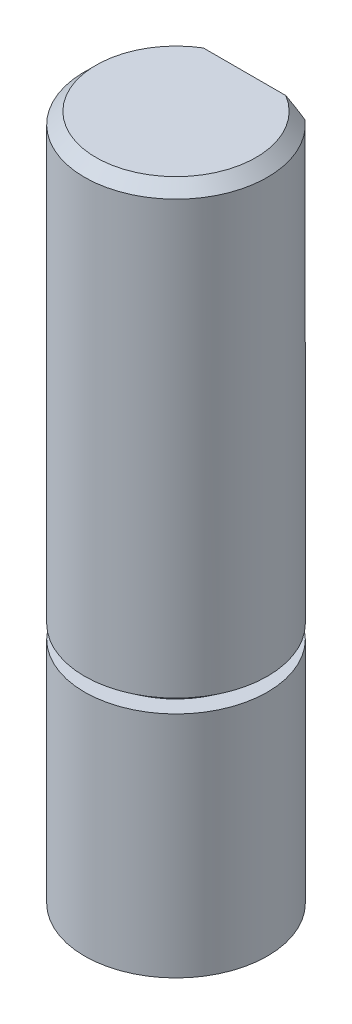
ISO-10303-21;
HEADER;
FILE_DESCRIPTION(('STEP AP214'),'2;1');
FILE_NAME('part.step','',(''),(''),'','','');
FILE_SCHEMA(('AUTOMOTIVE_DESIGN { 1 0 10303 214 1 1 1 1 }'));
ENDSEC;
DATA;
#1=APPLICATION_CONTEXT('core data for automotive mechanical design processes');
#2=APPLICATION_PROTOCOL_DEFINITION('international standard','automotive_design',2000,#1);
#3=PRODUCT_CONTEXT('',#1,'mechanical');
#4=PRODUCT('Part','Part','',(#3));
#5=PRODUCT_RELATED_PRODUCT_CATEGORY('part','',(#4));
#6=PRODUCT_DEFINITION_FORMATION('','',#4);
#7=PRODUCT_DEFINITION_CONTEXT('part definition',#1,'design');
#8=PRODUCT_DEFINITION('design','',#6,#7);
#9=PRODUCT_DEFINITION_SHAPE('','',#8);
#10=(LENGTH_UNIT() NAMED_UNIT(*) SI_UNIT(.MILLI.,.METRE.));
#11=(NAMED_UNIT(*) PLANE_ANGLE_UNIT() SI_UNIT($,.RADIAN.));
#12=(NAMED_UNIT(*) SI_UNIT($,.STERADIAN.) SOLID_ANGLE_UNIT());
#13=UNCERTAINTY_MEASURE_WITH_UNIT(LENGTH_MEASURE(1.E-05),#10,'distance_accuracy_value','');
#14=(GEOMETRIC_REPRESENTATION_CONTEXT(3) GLOBAL_UNCERTAINTY_ASSIGNED_CONTEXT((#13)) GLOBAL_UNIT_ASSIGNED_CONTEXT((#10,
#11,#12)) REPRESENTATION_CONTEXT('',''));
#15=CARTESIAN_POINT('',(0.,0.,0.));
#16=DIRECTION('',(0.,0.,1.));
#17=DIRECTION('',(1.,0.,0.));
#18=AXIS2_PLACEMENT_3D('',#15,#16,#17);
#19=CARTESIAN_POINT('',(0.,-10.,0.));
#20=DIRECTION('',(0.,1.,0.));
#21=DIRECTION('',(0.,0.,1.));
#22=AXIS2_PLACEMENT_3D('',#19,#20,#21);
#23=CYLINDRICAL_SURFACE('',#22,4.);
#24=CARTESIAN_POINT('',(0.,0.599999999999998,0.));
#25=DIRECTION('',(0.,1.,0.));
#26=DIRECTION('',(0.,0.,1.));
#27=AXIS2_PLACEMENT_3D('',#24,#25,#26);
#28=CIRCLE('',#27,4.);
#29=CARTESIAN_POINT('',(0.,0.599999999999998,4.));
#30=VERTEX_POINT('',#29);
#31=EDGE_CURVE('E37',#30,#30,#28,.F.);
#32=ORIENTED_EDGE('',*,*,#31,.F.);
#33=EDGE_LOOP('',(#32));
#34=FACE_BOUND('',#33,.T.);
#35=DIRECTION('',(0.,1.,0.));
#36=VECTOR('',#35,1.);
#37=CARTESIAN_POINT('',(2.64575131106459,8.,-3.));
#38=LINE('',#37,#36);
#39=CARTESIAN_POINT('',(2.64575131106459,8.,-3.));
#40=VERTEX_POINT('',#39);
#41=CARTESIAN_POINT('',(2.64575131106459,19.5,-3.));
#42=VERTEX_POINT('',#41);
#43=EDGE_CURVE('E76',#40,#42,#38,.T.);
#44=ORIENTED_EDGE('',*,*,#43,.T.);
#45=CARTESIAN_POINT('',(0.,19.5,0.));
#46=DIRECTION('',(0.,1.,0.));
#47=DIRECTION('',(0.,0.,1.));
#48=AXIS2_PLACEMENT_3D('',#45,#46,#47);
#49=CIRCLE('',#48,4.);
#50=CARTESIAN_POINT('',(-2.64575131106459,19.5,-3.));
#51=VERTEX_POINT('',#50);
#52=EDGE_CURVE('E80',#42,#51,#49,.F.);
#53=ORIENTED_EDGE('',*,*,#52,.T.);
#54=DIRECTION('',(0.,1.,0.));
#55=VECTOR('',#54,1.);
#56=CARTESIAN_POINT('',(-2.64575131106459,8.,-3.));
#57=LINE('',#56,#55);
#58=CARTESIAN_POINT('',(-2.64575131106459,8.,-3.));
#59=VERTEX_POINT('',#58);
#60=EDGE_CURVE('E74',#59,#51,#57,.T.);
#61=ORIENTED_EDGE('',*,*,#60,.F.);
#62=CARTESIAN_POINT('',(0.,8.,0.));
#63=DIRECTION('',(0.,1.,0.));
#64=DIRECTION('',(0.,0.,1.));
#65=AXIS2_PLACEMENT_3D('',#62,#63,#64);
#66=CIRCLE('',#65,4.);
#67=EDGE_CURVE('E66',#40,#59,#66,.T.);
#68=ORIENTED_EDGE('',*,*,#67,.F.);
#69=EDGE_LOOP('',(#44,#53,#61,#68));
#70=FACE_BOUND('',#69,.T.);
#71=ADVANCED_FACE('F32',(#34,#70),#23,.T.);
#72=CARTESIAN_POINT('',(0.,20.,0.));
#73=DIRECTION('',(0.,1.,0.));
#74=DIRECTION('',(0.,0.,1.));
#75=AXIS2_PLACEMENT_3D('',#72,#73,#74);
#76=PLANE('',#75);
#77=DIRECTION('',(1.,0.,0.));
#78=VECTOR('',#77,1.);
#79=CARTESIAN_POINT('',(-2.64575131106459,20.,-3.));
#80=LINE('',#79,#78);
#81=CARTESIAN_POINT('',(-1.80277563773199,20.,-3.));
#82=VERTEX_POINT('',#81);
#83=CARTESIAN_POINT('',(1.80277563773199,20.,-3.));
#84=VERTEX_POINT('',#83);
#85=EDGE_CURVE('E49',#82,#84,#80,.T.);
#86=ORIENTED_EDGE('',*,*,#85,.F.);
#87=CARTESIAN_POINT('',(0.,20.,0.));
#88=DIRECTION('',(0.,1.,0.));
#89=DIRECTION('',(0.,0.,1.));
#90=AXIS2_PLACEMENT_3D('',#87,#88,#89);
#91=CIRCLE('',#90,3.5);
#92=EDGE_CURVE('E88',#82,#84,#91,.T.);
#93=ORIENTED_EDGE('',*,*,#92,.T.);
#94=EDGE_LOOP('',(#86,#93));
#95=FACE_BOUND('',#94,.T.);
#96=ADVANCED_FACE('F101',(#95),#76,.T.);
#97=CARTESIAN_POINT('',(0.,20.,0.));
#98=DIRECTION('',(0.,-1.,0.));
#99=DIRECTION('',(0.,0.,-1.));
#100=AXIS2_PLACEMENT_3D('',#97,#98,#99);
#101=CONICAL_SURFACE('',#100,3.5,0.785398163397441);
#102=CARTESIAN_POINT('',(-5.83499505488498,16.938965989226,-3.));
#103=CARTESIAN_POINT('',(-5.66468696293555,17.0903757892782,-3.));
#104=CARTESIAN_POINT('',(-5.49373335194558,17.2410727937865,-3.));
#105=CARTESIAN_POINT('',(-5.15001939532075,17.5405200919112,-3.));
#106=CARTESIAN_POINT('',(-4.97725840019523,17.6892696392188,-3.));
#107=CARTESIAN_POINT('',(-4.62721157590965,17.986162252918,-3.));
#108=CARTESIAN_POINT('',(-4.44989613430195,18.1342705110441,-3.));
#109=CARTESIAN_POINT('',(-4.092347378892,18.4268634474971,-3.));
#110=CARTESIAN_POINT('',(-3.91211467799822,18.57134887112,-3.));
#111=CARTESIAN_POINT('',(-3.55645961437151,18.8484855787081,-3.));
#112=CARTESIAN_POINT('',(-3.38122119667173,18.9813720744677,-3.));
#113=CARTESIAN_POINT('',(-3.02586564459213,19.2407715989202,-3.));
#114=CARTESIAN_POINT('',(-2.84574568808317,19.3672808144583,-3.));
#115=CARTESIAN_POINT('',(-2.57103616471083,19.5496072378915,-3.));
#116=CARTESIAN_POINT('',(-2.4788592059619,19.6090558718568,-3.));
#117=CARTESIAN_POINT('',(-2.29264891488346,19.7249614937999,-3.));
#118=CARTESIAN_POINT('',(-2.19861581084785,19.7814188465777,-3.));
#119=CARTESIAN_POINT('',(-2.00849807495957,19.8905659215363,-3.));
#120=CARTESIAN_POINT('',(-1.9124155373908,19.9432592711028,-3.));
#121=CARTESIAN_POINT('',(-1.71784609767845,20.0439809627031,-3.));
#122=CARTESIAN_POINT('',(-1.6193598185815,20.0920104978553,-3.));
#123=CARTESIAN_POINT('',(-1.42683682628037,20.1790019774945,-3.));
#124=CARTESIAN_POINT('',(-1.33298336568436,20.2183662352781,-3.));
#125=CARTESIAN_POINT('',(-1.14287816274401,20.290879547616,-3.));
#126=CARTESIAN_POINT('',(-1.04662643537552,20.3240286409694,-3.));
#127=CARTESIAN_POINT('',(-0.852297204491023,20.3826486518219,-3.));
#128=CARTESIAN_POINT('',(-0.754231016369807,20.4081565506004,-3.));
#129=CARTESIAN_POINT('',(-0.556235100208591,20.4504005055917,-3.));
#130=CARTESIAN_POINT('',(-0.456306110190389,20.4671399623644,-3.));
#131=CARTESIAN_POINT('',(-0.253836760284143,20.4909810916827,-3.));
#132=CARTESIAN_POINT('',(-0.151279477555893,20.4979421404769,-3.));
#133=CARTESIAN_POINT('',(0.0540034437574867,20.5012693591197,-3.));
#134=CARTESIAN_POINT('',(0.156729071681949,20.4976361757773,-3.));
#135=CARTESIAN_POINT('',(0.361571241381389,20.4800191738942,-3.));
#136=CARTESIAN_POINT('',(0.463685160955773,20.4660054383055,-3.));
#137=CARTESIAN_POINT('',(0.666157326793159,20.4285425687719,-3.));
#138=CARTESIAN_POINT('',(0.766515087451494,20.4050908667978,-3.));
#139=CARTESIAN_POINT('',(1.00005180665005,20.3403413656696,-3.));
#140=CARTESIAN_POINT('',(1.13228749499848,20.2956653952456,-3.));
#141=CARTESIAN_POINT('',(1.39228431190691,20.1948443980072,-3.));
#142=CARTESIAN_POINT('',(1.52004259131288,20.1386922182714,-3.));
#143=CARTESIAN_POINT('',(1.77261496698481,20.017215977585,-3.));
#144=CARTESIAN_POINT('',(1.89738774367904,19.9518071340137,-3.));
#145=CARTESIAN_POINT('',(2.14321034752908,19.814491676355,-3.));
#146=CARTESIAN_POINT('',(2.26426131694084,19.7425870830994,-3.));
#147=CARTESIAN_POINT('',(2.54422316056008,19.5684288351179,-3.));
#148=CARTESIAN_POINT('',(2.70190655763035,19.4642131606477,-3.));
#149=CARTESIAN_POINT('',(3.01304239672184,19.2496151327713,-3.));
#150=CARTESIAN_POINT('',(3.16649349396237,19.1392308522974,-3.));
#151=CARTESIAN_POINT('',(3.4703228712838,18.9138517191536,-3.));
#152=CARTESIAN_POINT('',(3.62069604360685,18.7988500139063,-3.));
#153=CARTESIAN_POINT('',(3.9188603245849,18.5655436104449,-3.));
#154=CARTESIAN_POINT('',(4.06665128417604,18.4472387225647,-3.));
#155=CARTESIAN_POINT('',(4.3516336603564,18.2150876682171,-3.));
#156=CARTESIAN_POINT('',(4.48894094595218,18.1013833244623,-3.));
#157=CARTESIAN_POINT('',(4.76208709604533,17.8722156383541,-3.));
#158=CARTESIAN_POINT('',(4.89792589797848,17.756752221557,-3.));
#159=CARTESIAN_POINT('',(5.16787384553186,17.5248722727418,-3.));
#160=CARTESIAN_POINT('',(5.30198764827924,17.4084611525822,-3.));
#161=CARTESIAN_POINT('',(5.56920033722529,17.174505055193,-3.));
#162=CARTESIAN_POINT('',(5.70229932009186,17.056960188438,-3.));
#163=CARTESIAN_POINT('',(5.83499505488499,16.938965989226,-3.));
#164=B_SPLINE_CURVE_WITH_KNOTS('',3,(#102,#103,#104,#105,#106,#107,#108,#109,#110,#111,#112,
#113,#114,#115,#116,#117,#118,#119,#120,#121,#122,#123,#124,#125,#126,#127,#128,#129,#130,#131,
#132,#133,#134,#135,#136,#137,#138,#139,#140,#141,#142,#143,#144,#145,#146,#147,#148,#149,#150,
#151,#152,#153,#154,#155,#156,#157,#158,#159,#160,#161,#162,#163),.UNSPECIFIED.,.F.,.F.,(4,2,2,
2,2,2,2,2,2,2,2,2,2,2,2,2,2,2,2,2,2,2,2,2,2,2,2,2,2,2,4),(0.,0.683654507752663,1.36756375940587,
2.0606332178344,2.7535589071067,3.41324718742776,4.07332534564769,4.40233598103029,
4.73130639930385,5.05995538641393,5.3885200743044,5.69366382177044,5.99880566425846,
6.30244591525519,6.60596832173769,6.91381250668969,7.22163789724308,7.5303539180815,
7.83915399604654,8.25715240118375,8.67541213636582,9.09778590261384,9.52002871767134,
10.0868377591344,10.6538248720809,11.221687015145,11.7895818316996,12.3243890194947,
12.8592189034718,13.3919807283701,13.9246911539601),.UNSPECIFIED.);
#165=EDGE_CURVE('E11',#51,#82,#164,.T.);
#166=ORIENTED_EDGE('',*,*,#165,.F.);
#167=ORIENTED_EDGE('',*,*,#52,.F.);
#168=EDGE_CURVE('E42',#84,#42,#164,.T.);
#169=ORIENTED_EDGE('',*,*,#168,.F.);
#170=ORIENTED_EDGE('',*,*,#92,.F.);
#171=EDGE_LOOP('',(#166,#167,#169,#170));
#172=FACE_BOUND('',#171,.T.);
#173=ADVANCED_FACE('F34',(#172),#101,.T.);
#174=CARTESIAN_POINT('',(-2.64575131106459,8.,-3.));
#175=DIRECTION('',(0.,0.,1.));
#176=DIRECTION('',(1.,0.,0.));
#177=AXIS2_PLACEMENT_3D('',#174,#175,#176);
#178=PLANE('',#177);
#179=ORIENTED_EDGE('',*,*,#165,.T.);
#180=ORIENTED_EDGE('',*,*,#85,.T.);
#181=ORIENTED_EDGE('',*,*,#168,.T.);
#182=ORIENTED_EDGE('',*,*,#43,.F.);
#183=DIRECTION('',(1.,0.,0.));
#184=VECTOR('',#183,1.);
#185=CARTESIAN_POINT('',(-2.64575131106459,8.,-3.));
#186=LINE('',#185,#184);
#187=EDGE_CURVE('E69',#59,#40,#186,.T.);
#188=ORIENTED_EDGE('',*,*,#187,.F.);
#189=ORIENTED_EDGE('',*,*,#60,.T.);
#190=EDGE_LOOP('',(#179,#180,#181,#182,#188,#189));
#191=FACE_BOUND('',#190,.T.);
#192=ADVANCED_FACE('F73',(#191),#178,.F.);
#193=CARTESIAN_POINT('',(0.,8.,0.));
#194=DIRECTION('',(0.,1.,0.));
#195=DIRECTION('',(0.,0.,1.));
#196=AXIS2_PLACEMENT_3D('',#193,#194,#195);
#197=PLANE('',#196);
#198=ORIENTED_EDGE('',*,*,#67,.T.);
#199=ORIENTED_EDGE('',*,*,#187,.T.);
#200=EDGE_LOOP('',(#198,#199));
#201=FACE_BOUND('',#200,.T.);
#202=ADVANCED_FACE('F68',(#201),#197,.T.);
#203=CARTESIAN_POINT('',(0.,0.599999999999999,-4.90189227485523));
#204=DIRECTION('',(0.,1.,0.));
#205=DIRECTION('',(0.,0.,1.));
#206=AXIS2_PLACEMENT_3D('',#203,#204,#205);
#207=PLANE('',#206);
#208=ORIENTED_EDGE('',*,*,#31,.T.);
#209=EDGE_LOOP('',(#208));
#210=FACE_BOUND('',#209,.T.);
#211=CARTESIAN_POINT('',(0.,0.599999999999998,0.));
#212=DIRECTION('',(0.,-1.,0.));
#213=DIRECTION('',(0.,0.,-1.));
#214=AXIS2_PLACEMENT_3D('',#211,#212,#213);
#215=CIRCLE('',#214,3.2);
#216=CARTESIAN_POINT('',(0.,0.599999999999998,-3.2));
#217=VERTEX_POINT('',#216);
#218=EDGE_CURVE('E124',#217,#217,#215,.T.);
#219=ORIENTED_EDGE('',*,*,#218,.F.);
#220=EDGE_LOOP('',(#219));
#221=FACE_BOUND('',#220,.T.);
#222=ADVANCED_FACE('F138',(#210,#221),#207,.F.);
#223=CARTESIAN_POINT('',(0.,0.,0.));
#224=DIRECTION('',(0.,-1.,0.));
#225=DIRECTION('',(0.,0.,-1.));
#226=AXIS2_PLACEMENT_3D('',#223,#224,#225);
#227=CYLINDRICAL_SURFACE('',#226,3.2);
#228=CARTESIAN_POINT('',(0.,0.,0.));
#229=DIRECTION('',(0.,-1.,0.));
#230=DIRECTION('',(0.,0.,-1.));
#231=AXIS2_PLACEMENT_3D('',#228,#229,#230);
#232=CIRCLE('',#231,3.2);
#233=CARTESIAN_POINT('',(0.,0.,-3.2));
#234=VERTEX_POINT('',#233);
#235=EDGE_CURVE('E127',#234,#234,#232,.T.);
#236=ORIENTED_EDGE('',*,*,#235,.F.);
#237=EDGE_LOOP('',(#236));
#238=FACE_BOUND('',#237,.T.);
#239=ORIENTED_EDGE('',*,*,#218,.T.);
#240=EDGE_LOOP('',(#239));
#241=FACE_BOUND('',#240,.T.);
#242=ADVANCED_FACE('F136',(#238,#241),#227,.T.);
#243=CARTESIAN_POINT('',(0.,0.,-3.2));
#244=DIRECTION('',(0.,-1.,0.));
#245=DIRECTION('',(0.,0.,-1.));
#246=AXIS2_PLACEMENT_3D('',#243,#244,#245);
#247=PLANE('',#246);
#248=CARTESIAN_POINT('',(0.,0.,0.));
#249=DIRECTION('',(0.,-1.,0.));
#250=DIRECTION('',(0.,0.,-1.));
#251=AXIS2_PLACEMENT_3D('',#248,#249,#250);
#252=CIRCLE('',#251,4.);
#253=CARTESIAN_POINT('',(0.,0.,-4.));
#254=VERTEX_POINT('',#253);
#255=EDGE_CURVE('E95',#254,#254,#252,.F.);
#256=ORIENTED_EDGE('',*,*,#255,.T.);
#257=EDGE_LOOP('',(#256));
#258=FACE_BOUND('',#257,.T.);
#259=ORIENTED_EDGE('',*,*,#235,.T.);
#260=EDGE_LOOP('',(#259));
#261=FACE_BOUND('',#260,.T.);
#262=ADVANCED_FACE('F108',(#258,#261),#247,.F.);
#263=CARTESIAN_POINT('',(0.,-10.,0.));
#264=DIRECTION('',(0.,1.,0.));
#265=DIRECTION('',(0.,0.,1.));
#266=AXIS2_PLACEMENT_3D('',#263,#264,#265);
#267=PLANE('',#266);
#268=CARTESIAN_POINT('',(0.,-10.,0.));
#269=DIRECTION('',(0.,1.,0.));
#270=DIRECTION('',(0.,0.,1.));
#271=AXIS2_PLACEMENT_3D('',#268,#269,#270);
#272=CIRCLE('',#271,4.);
#273=CARTESIAN_POINT('',(0.,-10.,4.));
#274=VERTEX_POINT('',#273);
#275=EDGE_CURVE('E82',#274,#274,#272,.T.);
#276=ORIENTED_EDGE('',*,*,#275,.F.);
#277=EDGE_LOOP('',(#276));
#278=FACE_BOUND('',#277,.T.);
#279=ADVANCED_FACE('F105',(#278),#267,.F.);
#280=ORIENTED_EDGE('',*,*,#255,.F.);
#281=EDGE_LOOP('',(#280));
#282=FACE_BOUND('',#281,.T.);
#283=ORIENTED_EDGE('',*,*,#275,.T.);
#284=EDGE_LOOP('',(#283));
#285=FACE_BOUND('',#284,.T.);
#286=ADVANCED_FACE('F107',(#282,#285),#23,.T.);
#287=CLOSED_SHELL('',(#71,#96,#173,#192,#202,#222,#242,#262,#279,#286));
#288=MANIFOLD_SOLID_BREP('B2',#287);
#289=ADVANCED_BREP_SHAPE_REPRESENTATION('',(#18,#288),#14);
#290=SHAPE_DEFINITION_REPRESENTATION(#9,#289);
ENDSEC;
END-ISO-10303-21;
